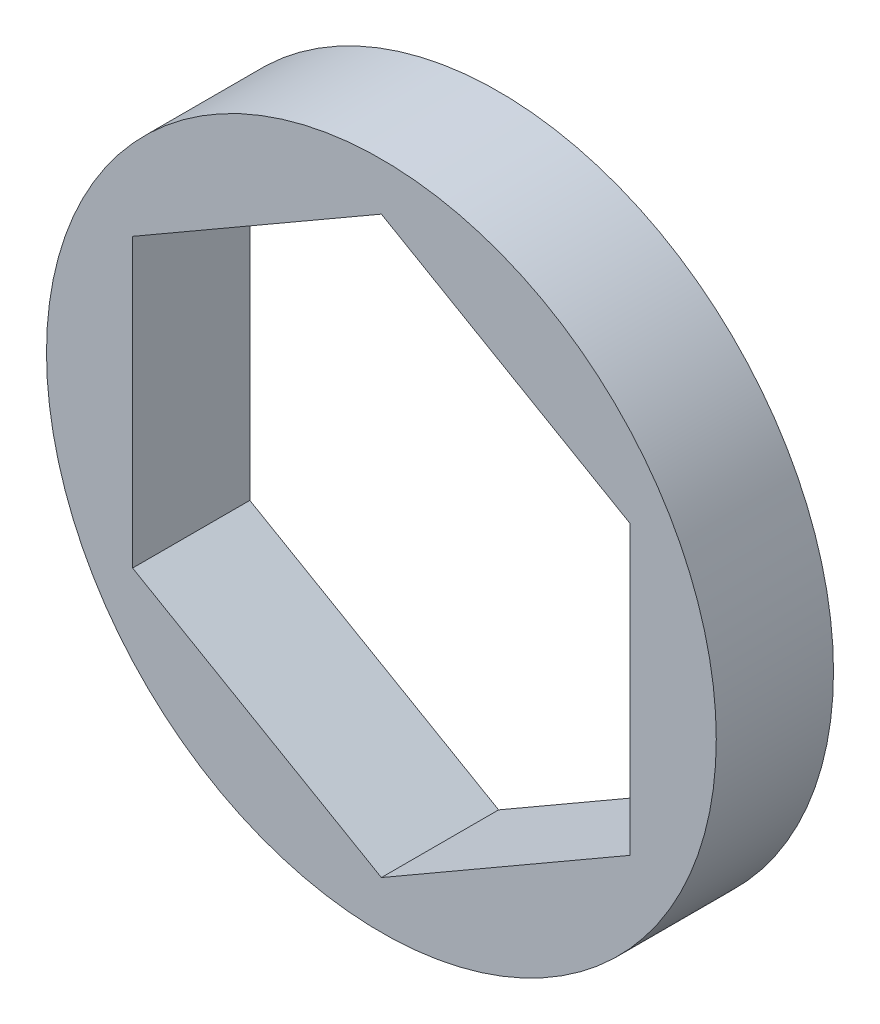
ISO-10303-21;
HEADER;
FILE_DESCRIPTION(('STEP AP214'),'2;1');
FILE_NAME('part.step','',(''),(''),'','','');
FILE_SCHEMA(('AUTOMOTIVE_DESIGN { 1 0 10303 214 1 1 1 1 }'));
ENDSEC;
DATA;
#1=APPLICATION_CONTEXT('core data for automotive mechanical design processes');
#2=APPLICATION_PROTOCOL_DEFINITION('international standard','automotive_design',2000,#1);
#3=PRODUCT_CONTEXT('',#1,'mechanical');
#4=PRODUCT('Part','Part','',(#3));
#5=PRODUCT_RELATED_PRODUCT_CATEGORY('part','',(#4));
#6=PRODUCT_DEFINITION_FORMATION('','',#4);
#7=PRODUCT_DEFINITION_CONTEXT('part definition',#1,'design');
#8=PRODUCT_DEFINITION('design','',#6,#7);
#9=PRODUCT_DEFINITION_SHAPE('','',#8);
#10=(LENGTH_UNIT() NAMED_UNIT(*) SI_UNIT(.MILLI.,.METRE.));
#11=(NAMED_UNIT(*) PLANE_ANGLE_UNIT() SI_UNIT($,.RADIAN.));
#12=(NAMED_UNIT(*) SI_UNIT($,.STERADIAN.) SOLID_ANGLE_UNIT());
#13=UNCERTAINTY_MEASURE_WITH_UNIT(LENGTH_MEASURE(1.E-05),#10,'distance_accuracy_value','');
#14=(GEOMETRIC_REPRESENTATION_CONTEXT(3) GLOBAL_UNCERTAINTY_ASSIGNED_CONTEXT((#13)) GLOBAL_UNIT_ASSIGNED_CONTEXT((#10,
#11,#12)) REPRESENTATION_CONTEXT('',''));
#15=CARTESIAN_POINT('',(0.,0.,0.));
#16=DIRECTION('',(0.,0.,1.));
#17=DIRECTION('',(1.,0.,0.));
#18=AXIS2_PLACEMENT_3D('',#15,#16,#17);
#19=CARTESIAN_POINT('',(0.,0.,1.55575));
#20=DIRECTION('',(0.,0.,1.));
#21=DIRECTION('',(1.,0.,0.));
#22=AXIS2_PLACEMENT_3D('',#19,#20,#21);
#23=PLANE('',#22);
#24=CARTESIAN_POINT('',(0.,0.,1.55575));
#25=DIRECTION('',(0.,0.,1.));
#26=DIRECTION('',(1.,0.,0.));
#27=AXIS2_PLACEMENT_3D('',#24,#25,#26);
#28=CIRCLE('',#27,8.89);
#29=CARTESIAN_POINT('',(8.89,0.,1.55575));
#30=VERTEX_POINT('',#29);
#31=EDGE_CURVE('E11',#30,#30,#28,.T.);
#32=ORIENTED_EDGE('',*,*,#31,.T.);
#33=EDGE_LOOP('',(#32));
#34=FACE_BOUND('',#33,.T.);
#35=DIRECTION('',(-0.866025403784439,-0.5,0.));
#36=VECTOR('',#35,1.);
#37=CARTESIAN_POINT('',(0.,7.62564235545658,1.55575));
#38=LINE('',#37,#36);
#39=CARTESIAN_POINT('',(0.,7.62564235545658,1.55575));
#40=VERTEX_POINT('',#39);
#41=CARTESIAN_POINT('',(-6.604,3.81282117772829,1.55575));
#42=VERTEX_POINT('',#41);
#43=EDGE_CURVE('E108',#40,#42,#38,.T.);
#44=ORIENTED_EDGE('',*,*,#43,.F.);
#45=DIRECTION('',(-0.866025403784439,0.5,0.));
#46=VECTOR('',#45,1.);
#47=CARTESIAN_POINT('',(6.604,3.81282117772829,1.55575));
#48=LINE('',#47,#46);
#49=CARTESIAN_POINT('',(6.604,3.81282117772829,1.55575));
#50=VERTEX_POINT('',#49);
#51=EDGE_CURVE('E99',#50,#40,#48,.T.);
#52=ORIENTED_EDGE('',*,*,#51,.F.);
#53=DIRECTION('',(0.,1.,0.));
#54=VECTOR('',#53,1.);
#55=CARTESIAN_POINT('',(6.604,-3.81282117772829,1.55575));
#56=LINE('',#55,#54);
#57=CARTESIAN_POINT('',(6.604,-3.81282117772829,1.55575));
#58=VERTEX_POINT('',#57);
#59=EDGE_CURVE('E133',#58,#50,#56,.T.);
#60=ORIENTED_EDGE('',*,*,#59,.F.);
#61=DIRECTION('',(0.866025403784439,0.5,0.));
#62=VECTOR('',#61,1.);
#63=CARTESIAN_POINT('',(0.,-7.62564235545658,1.55575));
#64=LINE('',#63,#62);
#65=CARTESIAN_POINT('',(0.,-7.62564235545658,1.55575));
#66=VERTEX_POINT('',#65);
#67=EDGE_CURVE('E130',#66,#58,#64,.T.);
#68=ORIENTED_EDGE('',*,*,#67,.F.);
#69=DIRECTION('',(0.866025403784439,-0.5,0.));
#70=VECTOR('',#69,1.);
#71=CARTESIAN_POINT('',(-6.604,-3.81282117772829,1.55575));
#72=LINE('',#71,#70);
#73=CARTESIAN_POINT('',(-6.604,-3.81282117772829,1.55575));
#74=VERTEX_POINT('',#73);
#75=EDGE_CURVE('E125',#74,#66,#72,.T.);
#76=ORIENTED_EDGE('',*,*,#75,.F.);
#77=DIRECTION('',(0.,-1.,0.));
#78=VECTOR('',#77,1.);
#79=CARTESIAN_POINT('',(-6.604,3.81282117772829,1.55575));
#80=LINE('',#79,#78);
#81=EDGE_CURVE('E121',#42,#74,#80,.T.);
#82=ORIENTED_EDGE('',*,*,#81,.F.);
#83=EDGE_LOOP('',(#44,#52,#60,#68,#76,#82));
#84=FACE_BOUND('',#83,.T.);
#85=ADVANCED_FACE('F45',(#34,#84),#23,.T.);
#86=CARTESIAN_POINT('',(0.,0.,-1.55575));
#87=DIRECTION('',(0.,0.,1.));
#88=DIRECTION('',(1.,0.,0.));
#89=AXIS2_PLACEMENT_3D('',#86,#87,#88);
#90=PLANE('',#89);
#91=CARTESIAN_POINT('',(0.,0.,-1.55575));
#92=DIRECTION('',(0.,0.,1.));
#93=DIRECTION('',(1.,0.,0.));
#94=AXIS2_PLACEMENT_3D('',#91,#92,#93);
#95=CIRCLE('',#94,8.89);
#96=CARTESIAN_POINT('',(8.89,0.,-1.55575));
#97=VERTEX_POINT('',#96);
#98=EDGE_CURVE('E49',#97,#97,#95,.T.);
#99=ORIENTED_EDGE('',*,*,#98,.F.);
#100=EDGE_LOOP('',(#99));
#101=FACE_BOUND('',#100,.T.);
#102=DIRECTION('',(-0.866025403784439,0.5,0.));
#103=VECTOR('',#102,1.);
#104=CARTESIAN_POINT('',(6.604,3.81282117772829,-1.55575));
#105=LINE('',#104,#103);
#106=CARTESIAN_POINT('',(6.604,3.81282117772829,-1.55575));
#107=VERTEX_POINT('',#106);
#108=CARTESIAN_POINT('',(0.,7.62564235545658,-1.55575));
#109=VERTEX_POINT('',#108);
#110=EDGE_CURVE('E69',#107,#109,#105,.T.);
#111=ORIENTED_EDGE('',*,*,#110,.T.);
#112=DIRECTION('',(-0.866025403784439,-0.5,0.));
#113=VECTOR('',#112,1.);
#114=CARTESIAN_POINT('',(0.,7.62564235545658,-1.55575));
#115=LINE('',#114,#113);
#116=CARTESIAN_POINT('',(-6.604,3.81282117772829,-1.55575));
#117=VERTEX_POINT('',#116);
#118=EDGE_CURVE('E115',#109,#117,#115,.T.);
#119=ORIENTED_EDGE('',*,*,#118,.T.);
#120=DIRECTION('',(0.,-1.,0.));
#121=VECTOR('',#120,1.);
#122=CARTESIAN_POINT('',(-6.604,3.81282117772829,-1.55575));
#123=LINE('',#122,#121);
#124=CARTESIAN_POINT('',(-6.604,-3.81282117772829,-1.55575));
#125=VERTEX_POINT('',#124);
#126=EDGE_CURVE('E140',#117,#125,#123,.T.);
#127=ORIENTED_EDGE('',*,*,#126,.T.);
#128=DIRECTION('',(0.866025403784439,-0.5,0.));
#129=VECTOR('',#128,1.);
#130=CARTESIAN_POINT('',(-6.604,-3.81282117772829,-1.55575));
#131=LINE('',#130,#129);
#132=CARTESIAN_POINT('',(0.,-7.62564235545658,-1.55575));
#133=VERTEX_POINT('',#132);
#134=EDGE_CURVE('E144',#125,#133,#131,.T.);
#135=ORIENTED_EDGE('',*,*,#134,.T.);
#136=DIRECTION('',(0.866025403784439,0.5,0.));
#137=VECTOR('',#136,1.);
#138=CARTESIAN_POINT('',(0.,-7.62564235545658,-1.55575));
#139=LINE('',#138,#137);
#140=CARTESIAN_POINT('',(6.604,-3.81282117772829,-1.55575));
#141=VERTEX_POINT('',#140);
#142=EDGE_CURVE('E148',#133,#141,#139,.T.);
#143=ORIENTED_EDGE('',*,*,#142,.T.);
#144=DIRECTION('',(0.,1.,0.));
#145=VECTOR('',#144,1.);
#146=CARTESIAN_POINT('',(6.604,-3.81282117772829,-1.55575));
#147=LINE('',#146,#145);
#148=EDGE_CURVE('E109',#141,#107,#147,.T.);
#149=ORIENTED_EDGE('',*,*,#148,.T.);
#150=EDGE_LOOP('',(#111,#119,#127,#135,#143,#149));
#151=FACE_BOUND('',#150,.T.);
#152=ADVANCED_FACE('F172',(#101,#151),#90,.F.);
#153=CARTESIAN_POINT('',(0.,0.,1.55575));
#154=DIRECTION('',(0.,0.,-1.));
#155=DIRECTION('',(-1.,0.,0.));
#156=AXIS2_PLACEMENT_3D('',#153,#154,#155);
#157=CYLINDRICAL_SURFACE('',#156,8.89);
#158=ORIENTED_EDGE('',*,*,#31,.F.);
#159=EDGE_LOOP('',(#158));
#160=FACE_BOUND('',#159,.T.);
#161=ORIENTED_EDGE('',*,*,#98,.T.);
#162=EDGE_LOOP('',(#161));
#163=FACE_BOUND('',#162,.T.);
#164=ADVANCED_FACE('F47',(#160,#163),#157,.T.);
#165=CARTESIAN_POINT('',(6.604,3.81282117772829,1.55575));
#166=DIRECTION('',(-0.5,-0.866025403784439,0.));
#167=DIRECTION('',(0.866025403784439,-0.5,0.));
#168=AXIS2_PLACEMENT_3D('',#165,#166,#167);
#169=PLANE('',#168);
#170=ORIENTED_EDGE('',*,*,#110,.F.);
#171=DIRECTION('',(0.,0.,-1.));
#172=VECTOR('',#171,1.);
#173=CARTESIAN_POINT('',(6.604,3.81282117772829,1.55575));
#174=LINE('',#173,#172);
#175=EDGE_CURVE('E103',#50,#107,#174,.T.);
#176=ORIENTED_EDGE('',*,*,#175,.F.);
#177=ORIENTED_EDGE('',*,*,#51,.T.);
#178=DIRECTION('',(0.,0.,-1.));
#179=VECTOR('',#178,1.);
#180=CARTESIAN_POINT('',(0.,7.62564235545658,1.55575));
#181=LINE('',#180,#179);
#182=EDGE_CURVE('E102',#40,#109,#181,.T.);
#183=ORIENTED_EDGE('',*,*,#182,.T.);
#184=EDGE_LOOP('',(#170,#176,#177,#183));
#185=FACE_BOUND('',#184,.T.);
#186=ADVANCED_FACE('F101',(#185),#169,.T.);
#187=CARTESIAN_POINT('',(0.,7.62564235545658,1.55575));
#188=DIRECTION('',(0.5,-0.866025403784439,0.));
#189=DIRECTION('',(0.866025403784439,0.5,0.));
#190=AXIS2_PLACEMENT_3D('',#187,#188,#189);
#191=PLANE('',#190);
#192=ORIENTED_EDGE('',*,*,#118,.F.);
#193=ORIENTED_EDGE('',*,*,#182,.F.);
#194=ORIENTED_EDGE('',*,*,#43,.T.);
#195=DIRECTION('',(0.,0.,-1.));
#196=VECTOR('',#195,1.);
#197=CARTESIAN_POINT('',(-6.604,3.81282117772829,1.55575));
#198=LINE('',#197,#196);
#199=EDGE_CURVE('E117',#42,#117,#198,.T.);
#200=ORIENTED_EDGE('',*,*,#199,.T.);
#201=EDGE_LOOP('',(#192,#193,#194,#200));
#202=FACE_BOUND('',#201,.T.);
#203=ADVANCED_FACE('F112',(#202),#191,.T.);
#204=CARTESIAN_POINT('',(-6.604,3.81282117772829,1.55575));
#205=DIRECTION('',(1.,0.,0.));
#206=DIRECTION('',(0.,1.,0.));
#207=AXIS2_PLACEMENT_3D('',#204,#205,#206);
#208=PLANE('',#207);
#209=ORIENTED_EDGE('',*,*,#126,.F.);
#210=ORIENTED_EDGE('',*,*,#199,.F.);
#211=ORIENTED_EDGE('',*,*,#81,.T.);
#212=DIRECTION('',(0.,0.,-1.));
#213=VECTOR('',#212,1.);
#214=CARTESIAN_POINT('',(-6.604,-3.81282117772829,1.55575));
#215=LINE('',#214,#213);
#216=EDGE_CURVE('E162',#74,#125,#215,.T.);
#217=ORIENTED_EDGE('',*,*,#216,.T.);
#218=EDGE_LOOP('',(#209,#210,#211,#217));
#219=FACE_BOUND('',#218,.T.);
#220=ADVANCED_FACE('F168',(#219),#208,.T.);
#221=CARTESIAN_POINT('',(-6.604,-3.81282117772829,1.55575));
#222=DIRECTION('',(0.5,0.866025403784439,0.));
#223=DIRECTION('',(-0.866025403784439,0.5,0.));
#224=AXIS2_PLACEMENT_3D('',#221,#222,#223);
#225=PLANE('',#224);
#226=ORIENTED_EDGE('',*,*,#134,.F.);
#227=ORIENTED_EDGE('',*,*,#216,.F.);
#228=ORIENTED_EDGE('',*,*,#75,.T.);
#229=DIRECTION('',(0.,0.,-1.));
#230=VECTOR('',#229,1.);
#231=CARTESIAN_POINT('',(0.,-7.62564235545658,1.55575));
#232=LINE('',#231,#230);
#233=EDGE_CURVE('E159',#66,#133,#232,.T.);
#234=ORIENTED_EDGE('',*,*,#233,.T.);
#235=EDGE_LOOP('',(#226,#227,#228,#234));
#236=FACE_BOUND('',#235,.T.);
#237=ADVANCED_FACE('F180',(#236),#225,.T.);
#238=CARTESIAN_POINT('',(0.,-7.62564235545658,1.55575));
#239=DIRECTION('',(-0.5,0.866025403784439,0.));
#240=DIRECTION('',(-0.866025403784439,-0.5,0.));
#241=AXIS2_PLACEMENT_3D('',#238,#239,#240);
#242=PLANE('',#241);
#243=ORIENTED_EDGE('',*,*,#142,.F.);
#244=ORIENTED_EDGE('',*,*,#233,.F.);
#245=ORIENTED_EDGE('',*,*,#67,.T.);
#246=DIRECTION('',(0.,0.,-1.));
#247=VECTOR('',#246,1.);
#248=CARTESIAN_POINT('',(6.604,-3.81282117772829,1.55575));
#249=LINE('',#248,#247);
#250=EDGE_CURVE('E61',#58,#141,#249,.T.);
#251=ORIENTED_EDGE('',*,*,#250,.T.);
#252=EDGE_LOOP('',(#243,#244,#245,#251));
#253=FACE_BOUND('',#252,.T.);
#254=ADVANCED_FACE('F178',(#253),#242,.T.);
#255=CARTESIAN_POINT('',(6.604,-3.81282117772829,1.55575));
#256=DIRECTION('',(-1.,0.,0.));
#257=DIRECTION('',(0.,-1.,0.));
#258=AXIS2_PLACEMENT_3D('',#255,#256,#257);
#259=PLANE('',#258);
#260=ORIENTED_EDGE('',*,*,#148,.F.);
#261=ORIENTED_EDGE('',*,*,#250,.F.);
#262=ORIENTED_EDGE('',*,*,#59,.T.);
#263=ORIENTED_EDGE('',*,*,#175,.T.);
#264=EDGE_LOOP('',(#260,#261,#262,#263));
#265=FACE_BOUND('',#264,.T.);
#266=ADVANCED_FACE('F174',(#265),#259,.T.);
#267=CLOSED_SHELL('',(#85,#152,#164,#186,#203,#220,#237,#254,#266));
#268=MANIFOLD_SOLID_BREP('B2',#267);
#269=ADVANCED_BREP_SHAPE_REPRESENTATION('',(#18,#268),#14);
#270=SHAPE_DEFINITION_REPRESENTATION(#9,#269);
ENDSEC;
END-ISO-10303-21;
